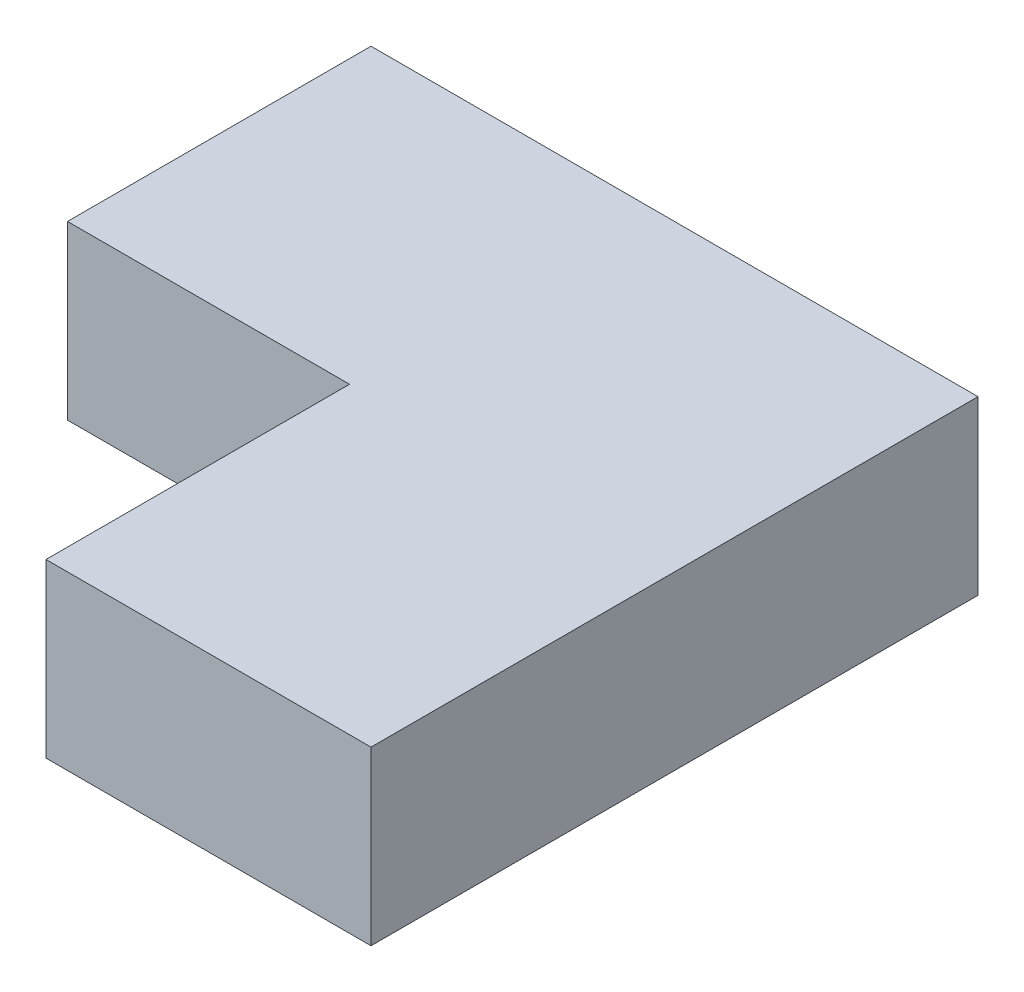
ISO-10303-21;
HEADER;
FILE_DESCRIPTION(('STEP AP214'),'2;1');
FILE_NAME('part.step','',(''),(''),'','','');
FILE_SCHEMA(('AUTOMOTIVE_DESIGN { 1 0 10303 214 1 1 1 1 }'));
ENDSEC;
DATA;
#1=APPLICATION_CONTEXT('core data for automotive mechanical design processes');
#2=APPLICATION_PROTOCOL_DEFINITION('international standard','automotive_design',2000,#1);
#3=PRODUCT_CONTEXT('',#1,'mechanical');
#4=PRODUCT('Part','Part','',(#3));
#5=PRODUCT_RELATED_PRODUCT_CATEGORY('part','',(#4));
#6=PRODUCT_DEFINITION_FORMATION('','',#4);
#7=PRODUCT_DEFINITION_CONTEXT('part definition',#1,'design');
#8=PRODUCT_DEFINITION('design','',#6,#7);
#9=PRODUCT_DEFINITION_SHAPE('','',#8);
#10=(LENGTH_UNIT() NAMED_UNIT(*) SI_UNIT(.MILLI.,.METRE.));
#11=(NAMED_UNIT(*) PLANE_ANGLE_UNIT() SI_UNIT($,.RADIAN.));
#12=(NAMED_UNIT(*) SI_UNIT($,.STERADIAN.) SOLID_ANGLE_UNIT());
#13=UNCERTAINTY_MEASURE_WITH_UNIT(LENGTH_MEASURE(1.E-05),#10,'distance_accuracy_value','');
#14=(GEOMETRIC_REPRESENTATION_CONTEXT(3) GLOBAL_UNCERTAINTY_ASSIGNED_CONTEXT((#13)) GLOBAL_UNIT_ASSIGNED_CONTEXT((#10,
#11,#12)) REPRESENTATION_CONTEXT('',''));
#15=CARTESIAN_POINT('',(0.,0.,0.));
#16=DIRECTION('',(0.,0.,1.));
#17=DIRECTION('',(1.,0.,0.));
#18=AXIS2_PLACEMENT_3D('',#15,#16,#17);
#19=CARTESIAN_POINT('',(-43.1386879561728,4.800000052,55.3406856903962));
#20=DIRECTION('',(-1.,0.,0.));
#21=DIRECTION('',(0.,0.,1.));
#22=AXIS2_PLACEMENT_3D('',#19,#20,#21);
#23=PLANE('',#22);
#24=DIRECTION('',(0.,0.,-1.));
#25=VECTOR('',#24,1.);
#26=CARTESIAN_POINT('',(-43.1386879561728,4.800000052,55.3406856903962));
#27=LINE('',#26,#25);
#28=CARTESIAN_POINT('',(-43.1386879561728,4.800000052,11.5147182580194));
#29=VERTEX_POINT('',#28);
#30=CARTESIAN_POINT('',(-43.1386879561728,4.800000052,-5.41861507531394));
#31=VERTEX_POINT('',#30);
#32=EDGE_CURVE('E105',#29,#31,#27,.T.);
#33=ORIENTED_EDGE('',*,*,#32,.F.);
#34=DIRECTION('',(0.,1.,0.));
#35=VECTOR('',#34,1.);
#36=CARTESIAN_POINT('',(-43.1386879561728,0.,11.5147182580194));
#37=LINE('',#36,#35);
#38=CARTESIAN_POINT('',(-43.1386879561728,0.,11.5147182580194));
#39=VERTEX_POINT('',#38);
#40=EDGE_CURVE('E120',#39,#29,#37,.T.);
#41=ORIENTED_EDGE('',*,*,#40,.F.);
#42=DIRECTION('',(0.,0.,-1.));
#43=VECTOR('',#42,1.);
#44=CARTESIAN_POINT('',(-43.1386879561728,0.,55.3406856903962));
#45=LINE('',#44,#43);
#46=CARTESIAN_POINT('',(-43.1386879561728,0.,-5.41861507531394));
#47=VERTEX_POINT('',#46);
#48=EDGE_CURVE('E106',#39,#47,#45,.T.);
#49=ORIENTED_EDGE('',*,*,#48,.T.);
#50=DIRECTION('',(0.,-1.,0.));
#51=VECTOR('',#50,1.);
#52=CARTESIAN_POINT('',(-43.1386879561728,4.800000052,-5.41861507531394));
#53=LINE('',#52,#51);
#54=EDGE_CURVE('E11',#31,#47,#53,.T.);
#55=ORIENTED_EDGE('',*,*,#54,.F.);
#56=EDGE_LOOP('',(#33,#41,#49,#55));
#57=FACE_BOUND('',#56,.T.);
#58=ADVANCED_FACE('F34',(#57),#23,.F.);
#59=CARTESIAN_POINT('',(-89.0947651495821,4.800000052,-5.41861507531394));
#60=DIRECTION('',(0.,0.,1.));
#61=DIRECTION('',(1.,0.,0.));
#62=AXIS2_PLACEMENT_3D('',#59,#60,#61);
#63=PLANE('',#62);
#64=DIRECTION('',(-1.,0.,0.));
#65=VECTOR('',#64,1.);
#66=CARTESIAN_POINT('',(-89.0947651495821,0.,-5.41861507531394));
#67=LINE('',#66,#65);
#68=CARTESIAN_POINT('',(-60.0720212895061,0.,-5.41861507531394));
#69=VERTEX_POINT('',#68);
#70=EDGE_CURVE('E99',#47,#69,#67,.T.);
#71=ORIENTED_EDGE('',*,*,#70,.T.);
#72=DIRECTION('',(0.,1.,0.));
#73=VECTOR('',#72,1.);
#74=CARTESIAN_POINT('',(-60.0720212895061,0.,-5.41861507531394));
#75=LINE('',#74,#73);
#76=CARTESIAN_POINT('',(-60.0720212895061,4.800000052,-5.41861507531394));
#77=VERTEX_POINT('',#76);
#78=EDGE_CURVE('E84',#69,#77,#75,.T.);
#79=ORIENTED_EDGE('',*,*,#78,.T.);
#80=DIRECTION('',(-1.,0.,0.));
#81=VECTOR('',#80,1.);
#82=CARTESIAN_POINT('',(-89.0947651495821,4.800000052,-5.41861507531394));
#83=LINE('',#82,#81);
#84=EDGE_CURVE('E41',#31,#77,#83,.T.);
#85=ORIENTED_EDGE('',*,*,#84,.F.);
#86=ORIENTED_EDGE('',*,*,#54,.T.);
#87=EDGE_LOOP('',(#71,#79,#85,#86));
#88=FACE_BOUND('',#87,.T.);
#89=ADVANCED_FACE('F103',(#88),#63,.F.);
#90=CARTESIAN_POINT('',(0.,4.800000052,0.));
#91=DIRECTION('',(0.,-1.,0.));
#92=DIRECTION('',(0.,0.,-1.));
#93=AXIS2_PLACEMENT_3D('',#90,#91,#92);
#94=PLANE('',#93);
#95=ORIENTED_EDGE('',*,*,#84,.T.);
#96=DIRECTION('',(0.,0.,-1.));
#97=VECTOR('',#96,1.);
#98=CARTESIAN_POINT('',(-60.0720212895061,4.800000052,-5.41861507531394));
#99=LINE('',#98,#97);
#100=CARTESIAN_POINT('',(-60.0720212895061,4.800000052,3.04804312468606));
#101=VERTEX_POINT('',#100);
#102=EDGE_CURVE('E87',#101,#77,#99,.T.);
#103=ORIENTED_EDGE('',*,*,#102,.F.);
#104=DIRECTION('',(-1.,0.,0.));
#105=VECTOR('',#104,1.);
#106=CARTESIAN_POINT('',(-89.0947651495821,4.800000052,3.04804312468606));
#107=LINE('',#106,#105);
#108=CARTESIAN_POINT('',(-52.2053544388395,4.800000052,3.04804312468606));
#109=VERTEX_POINT('',#108);
#110=EDGE_CURVE('E114',#109,#101,#107,.T.);
#111=ORIENTED_EDGE('',*,*,#110,.F.);
#112=DIRECTION('',(0.,0.,-1.));
#113=VECTOR('',#112,1.);
#114=CARTESIAN_POINT('',(-52.2053544388395,4.800000052,55.3406856903962));
#115=LINE('',#114,#113);
#116=CARTESIAN_POINT('',(-52.2053544388395,4.800000052,11.5147182580194));
#117=VERTEX_POINT('',#116);
#118=EDGE_CURVE('E118',#117,#109,#115,.T.);
#119=ORIENTED_EDGE('',*,*,#118,.F.);
#120=DIRECTION('',(-1.,0.,0.));
#121=VECTOR('',#120,1.);
#122=CARTESIAN_POINT('',(-43.1386879561728,4.800000052,11.5147182580194));
#123=LINE('',#122,#121);
#124=EDGE_CURVE('E56',#29,#117,#123,.T.);
#125=ORIENTED_EDGE('',*,*,#124,.F.);
#126=ORIENTED_EDGE('',*,*,#32,.T.);
#127=EDGE_LOOP('',(#95,#103,#111,#119,#125,#126));
#128=FACE_BOUND('',#127,.T.);
#129=ADVANCED_FACE('F134',(#128),#94,.F.);
#130=CARTESIAN_POINT('',(0.,0.,0.));
#131=DIRECTION('',(0.,-1.,0.));
#132=DIRECTION('',(0.,0.,-1.));
#133=AXIS2_PLACEMENT_3D('',#130,#131,#132);
#134=PLANE('',#133);
#135=DIRECTION('',(0.,0.,-1.));
#136=VECTOR('',#135,1.);
#137=CARTESIAN_POINT('',(-60.0720212895061,0.,-5.41861507531394));
#138=LINE('',#137,#136);
#139=CARTESIAN_POINT('',(-60.0720212895061,0.,3.04804312468606));
#140=VERTEX_POINT('',#139);
#141=EDGE_CURVE('E48',#140,#69,#138,.T.);
#142=ORIENTED_EDGE('',*,*,#141,.T.);
#143=ORIENTED_EDGE('',*,*,#70,.F.);
#144=ORIENTED_EDGE('',*,*,#48,.F.);
#145=DIRECTION('',(-1.,0.,0.));
#146=VECTOR('',#145,1.);
#147=CARTESIAN_POINT('',(-43.1386879561728,0.,11.5147182580194));
#148=LINE('',#147,#146);
#149=CARTESIAN_POINT('',(-52.2053544388395,0.,11.5147182580194));
#150=VERTEX_POINT('',#149);
#151=EDGE_CURVE('E125',#39,#150,#148,.T.);
#152=ORIENTED_EDGE('',*,*,#151,.T.);
#153=DIRECTION('',(0.,0.,-1.));
#154=VECTOR('',#153,1.);
#155=CARTESIAN_POINT('',(-52.2053544388395,0.,55.3406856903962));
#156=LINE('',#155,#154);
#157=CARTESIAN_POINT('',(-52.2053544388395,0.,3.04804312468606));
#158=VERTEX_POINT('',#157);
#159=EDGE_CURVE('E117',#150,#158,#156,.T.);
#160=ORIENTED_EDGE('',*,*,#159,.T.);
#161=DIRECTION('',(-1.,0.,0.));
#162=VECTOR('',#161,1.);
#163=CARTESIAN_POINT('',(-89.0947651495821,0.,3.04804312468606));
#164=LINE('',#163,#162);
#165=EDGE_CURVE('E101',#158,#140,#164,.T.);
#166=ORIENTED_EDGE('',*,*,#165,.T.);
#167=EDGE_LOOP('',(#142,#143,#144,#152,#160,#166));
#168=FACE_BOUND('',#167,.T.);
#169=ADVANCED_FACE('F97',(#168),#134,.T.);
#170=CARTESIAN_POINT('',(-89.0947651495821,0.,3.04804312468606));
#171=DIRECTION('',(0.,0.,-1.));
#172=DIRECTION('',(-1.,0.,0.));
#173=AXIS2_PLACEMENT_3D('',#170,#171,#172);
#174=PLANE('',#173);
#175=ORIENTED_EDGE('',*,*,#110,.T.);
#176=DIRECTION('',(0.,1.,0.));
#177=VECTOR('',#176,1.);
#178=CARTESIAN_POINT('',(-60.0720212895061,0.,3.04804312468606));
#179=LINE('',#178,#177);
#180=EDGE_CURVE('E92',#140,#101,#179,.T.);
#181=ORIENTED_EDGE('',*,*,#180,.F.);
#182=ORIENTED_EDGE('',*,*,#165,.F.);
#183=DIRECTION('',(0.,1.,0.));
#184=VECTOR('',#183,1.);
#185=CARTESIAN_POINT('',(-52.2053544388395,0.,3.04804312468606));
#186=LINE('',#185,#184);
#187=EDGE_CURVE('E108',#158,#109,#186,.T.);
#188=ORIENTED_EDGE('',*,*,#187,.T.);
#189=EDGE_LOOP('',(#175,#181,#182,#188));
#190=FACE_BOUND('',#189,.T.);
#191=ADVANCED_FACE('F136',(#190),#174,.F.);
#192=CARTESIAN_POINT('',(-52.2053544388395,0.,55.3406856903962));
#193=DIRECTION('',(1.,0.,0.));
#194=DIRECTION('',(0.,0.,-1.));
#195=AXIS2_PLACEMENT_3D('',#192,#193,#194);
#196=PLANE('',#195);
#197=ORIENTED_EDGE('',*,*,#159,.F.);
#198=DIRECTION('',(0.,1.,0.));
#199=VECTOR('',#198,1.);
#200=CARTESIAN_POINT('',(-52.2053544388395,0.,11.5147182580194));
#201=LINE('',#200,#199);
#202=EDGE_CURVE('E123',#150,#117,#201,.T.);
#203=ORIENTED_EDGE('',*,*,#202,.T.);
#204=ORIENTED_EDGE('',*,*,#118,.T.);
#205=ORIENTED_EDGE('',*,*,#187,.F.);
#206=EDGE_LOOP('',(#197,#203,#204,#205));
#207=FACE_BOUND('',#206,.T.);
#208=ADVANCED_FACE('F140',(#207),#196,.F.);
#209=CARTESIAN_POINT('',(-43.1386879561728,0.,11.5147182580194));
#210=DIRECTION('',(0.,0.,-1.));
#211=DIRECTION('',(-1.,0.,0.));
#212=AXIS2_PLACEMENT_3D('',#209,#210,#211);
#213=PLANE('',#212);
#214=ORIENTED_EDGE('',*,*,#124,.T.);
#215=ORIENTED_EDGE('',*,*,#202,.F.);
#216=ORIENTED_EDGE('',*,*,#151,.F.);
#217=ORIENTED_EDGE('',*,*,#40,.T.);
#218=EDGE_LOOP('',(#214,#215,#216,#217));
#219=FACE_BOUND('',#218,.T.);
#220=ADVANCED_FACE('F144',(#219),#213,.F.);
#221=CARTESIAN_POINT('',(-60.0720212895061,0.,-5.41861507531394));
#222=DIRECTION('',(1.,0.,0.));
#223=DIRECTION('',(0.,0.,-1.));
#224=AXIS2_PLACEMENT_3D('',#221,#222,#223);
#225=PLANE('',#224);
#226=ORIENTED_EDGE('',*,*,#102,.T.);
#227=ORIENTED_EDGE('',*,*,#78,.F.);
#228=ORIENTED_EDGE('',*,*,#141,.F.);
#229=ORIENTED_EDGE('',*,*,#180,.T.);
#230=EDGE_LOOP('',(#226,#227,#228,#229));
#231=FACE_BOUND('',#230,.T.);
#232=ADVANCED_FACE('F85',(#231),#225,.F.);
#233=CLOSED_SHELL('',(#58,#89,#129,#169,#191,#208,#220,#232));
#234=MANIFOLD_SOLID_BREP('B2',#233);
#235=ADVANCED_BREP_SHAPE_REPRESENTATION('',(#18,#234),#14);
#236=SHAPE_DEFINITION_REPRESENTATION(#9,#235);
ENDSEC;
END-ISO-10303-21;
